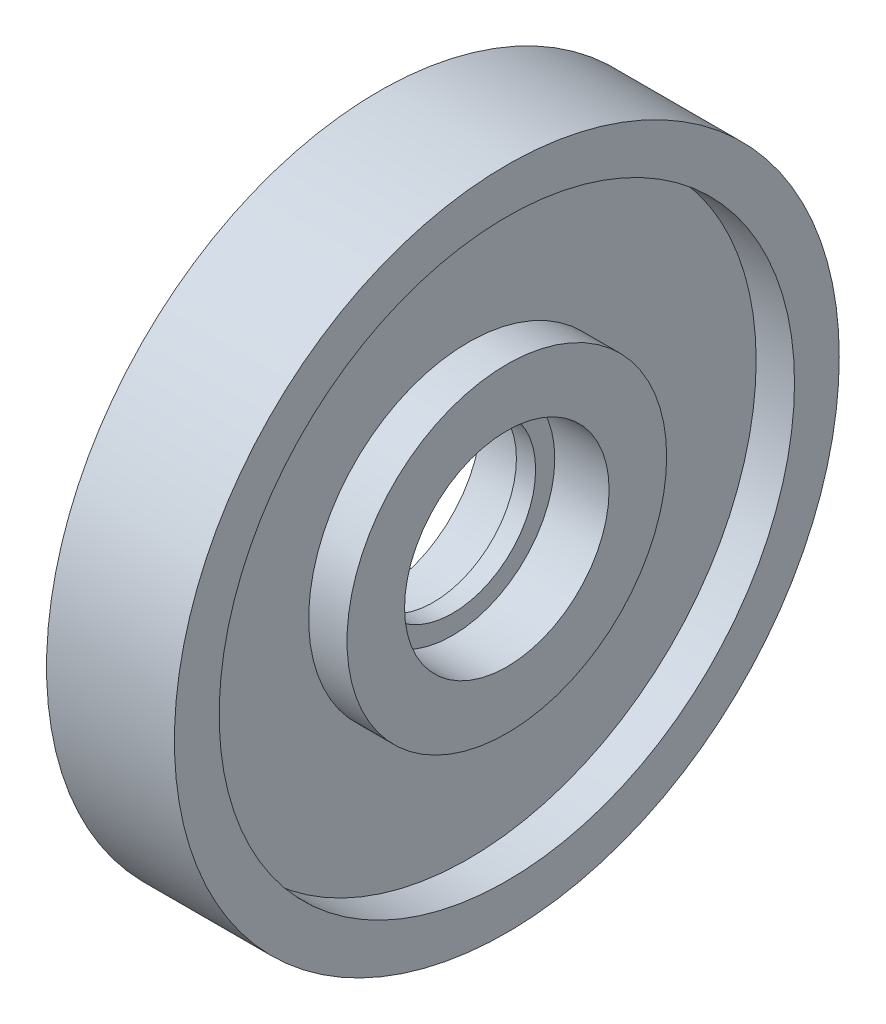
ISO-10303-21;
HEADER;
FILE_DESCRIPTION(('STEP AP214'),'2;1');
FILE_NAME('part.step','',(''),(''),'','','');
FILE_SCHEMA(('AUTOMOTIVE_DESIGN { 1 0 10303 214 1 1 1 1 }'));
ENDSEC;
DATA;
#1=APPLICATION_CONTEXT('core data for automotive mechanical design processes');
#2=APPLICATION_PROTOCOL_DEFINITION('international standard','automotive_design',2000,#1);
#3=PRODUCT_CONTEXT('',#1,'mechanical');
#4=PRODUCT('Part','Part','',(#3));
#5=PRODUCT_RELATED_PRODUCT_CATEGORY('part','',(#4));
#6=PRODUCT_DEFINITION_FORMATION('','',#4);
#7=PRODUCT_DEFINITION_CONTEXT('part definition',#1,'design');
#8=PRODUCT_DEFINITION('design','',#6,#7);
#9=PRODUCT_DEFINITION_SHAPE('','',#8);
#10=(LENGTH_UNIT() NAMED_UNIT(*) SI_UNIT(.MILLI.,.METRE.));
#11=(NAMED_UNIT(*) PLANE_ANGLE_UNIT() SI_UNIT($,.RADIAN.));
#12=(NAMED_UNIT(*) SI_UNIT($,.STERADIAN.) SOLID_ANGLE_UNIT());
#13=UNCERTAINTY_MEASURE_WITH_UNIT(LENGTH_MEASURE(1.E-05),#10,'distance_accuracy_value','');
#14=(GEOMETRIC_REPRESENTATION_CONTEXT(3) GLOBAL_UNCERTAINTY_ASSIGNED_CONTEXT((#13)) GLOBAL_UNIT_ASSIGNED_CONTEXT((#10,
#11,#12)) REPRESENTATION_CONTEXT('',''));
#15=CARTESIAN_POINT('',(0.,0.,0.));
#16=DIRECTION('',(0.,0.,1.));
#17=DIRECTION('',(1.,0.,0.));
#18=AXIS2_PLACEMENT_3D('',#15,#16,#17);
#19=CARTESIAN_POINT('',(0.,0.,0.));
#20=DIRECTION('',(1.,0.,0.));
#21=DIRECTION('',(0.,0.,-1.));
#22=AXIS2_PLACEMENT_3D('',#19,#20,#21);
#23=PLANE('',#22);
#24=CARTESIAN_POINT('',(0.,0.,0.));
#25=DIRECTION('',(1.,0.,0.));
#26=DIRECTION('',(0.,0.,-1.));
#27=AXIS2_PLACEMENT_3D('',#24,#25,#26);
#28=CIRCLE('',#27,8.);
#29=CARTESIAN_POINT('',(0.,0.,-8.));
#30=VERTEX_POINT('',#29);
#31=EDGE_CURVE('E61',#30,#30,#28,.T.);
#32=ORIENTED_EDGE('',*,*,#31,.T.);
#33=EDGE_LOOP('',(#32));
#34=FACE_BOUND('',#33,.T.);
#35=CARTESIAN_POINT('',(0.,0.,0.));
#36=DIRECTION('',(1.,0.,0.));
#37=DIRECTION('',(0.,0.,-1.));
#38=AXIS2_PLACEMENT_3D('',#35,#36,#37);
#39=CIRCLE('',#38,12.5);
#40=CARTESIAN_POINT('',(0.,0.,-12.5));
#41=VERTEX_POINT('',#40);
#42=EDGE_CURVE('E94',#41,#41,#39,.T.);
#43=ORIENTED_EDGE('',*,*,#42,.F.);
#44=EDGE_LOOP('',(#43));
#45=FACE_BOUND('',#44,.T.);
#46=ADVANCED_FACE('F43',(#34,#45),#23,.F.);
#47=CARTESIAN_POINT('',(10.,0.,0.));
#48=DIRECTION('',(1.,0.,0.));
#49=DIRECTION('',(0.,0.,-1.));
#50=AXIS2_PLACEMENT_3D('',#47,#48,#49);
#51=PLANE('',#50);
#52=CARTESIAN_POINT('',(10.,0.,0.));
#53=DIRECTION('',(1.,0.,0.));
#54=DIRECTION('',(0.,0.,-1.));
#55=AXIS2_PLACEMENT_3D('',#52,#53,#54);
#56=CIRCLE('',#55,8.);
#57=CARTESIAN_POINT('',(10.,0.,-8.));
#58=VERTEX_POINT('',#57);
#59=EDGE_CURVE('E59',#58,#58,#56,.T.);
#60=ORIENTED_EDGE('',*,*,#59,.F.);
#61=EDGE_LOOP('',(#60));
#62=FACE_BOUND('',#61,.T.);
#63=CARTESIAN_POINT('',(10.,0.,0.));
#64=DIRECTION('',(1.,0.,0.));
#65=DIRECTION('',(0.,0.,-1.));
#66=AXIS2_PLACEMENT_3D('',#63,#64,#65);
#67=CIRCLE('',#66,12.5);
#68=CARTESIAN_POINT('',(10.,0.,-12.5));
#69=VERTEX_POINT('',#68);
#70=EDGE_CURVE('E82',#69,#69,#67,.T.);
#71=ORIENTED_EDGE('',*,*,#70,.T.);
#72=EDGE_LOOP('',(#71));
#73=FACE_BOUND('',#72,.T.);
#74=ADVANCED_FACE('F110',(#62,#73),#51,.T.);
#75=CARTESIAN_POINT('',(10.,0.,0.));
#76=DIRECTION('',(-1.,0.,0.));
#77=DIRECTION('',(0.,0.,1.));
#78=AXIS2_PLACEMENT_3D('',#75,#76,#77);
#79=CYLINDRICAL_SURFACE('',#78,8.);
#80=ORIENTED_EDGE('',*,*,#31,.F.);
#81=EDGE_LOOP('',(#80));
#82=FACE_BOUND('',#81,.T.);
#83=CARTESIAN_POINT('',(4.25,0.,0.));
#84=DIRECTION('',(1.,0.,0.));
#85=DIRECTION('',(0.,0.,-1.));
#86=AXIS2_PLACEMENT_3D('',#83,#84,#85);
#87=CIRCLE('',#86,8.);
#88=CARTESIAN_POINT('',(4.25,0.,-8.));
#89=VERTEX_POINT('',#88);
#90=EDGE_CURVE('E64',#89,#89,#87,.T.);
#91=ORIENTED_EDGE('',*,*,#90,.T.);
#92=EDGE_LOOP('',(#91));
#93=FACE_BOUND('',#92,.T.);
#94=ADVANCED_FACE('F118',(#82,#93),#79,.F.);
#95=CARTESIAN_POINT('',(10.,0.,0.));
#96=DIRECTION('',(1.,0.,0.));
#97=DIRECTION('',(0.,0.,-1.));
#98=AXIS2_PLACEMENT_3D('',#95,#96,#97);
#99=CIRCLE('',#98,22.5);
#100=CARTESIAN_POINT('',(10.,0.,-22.5));
#101=VERTEX_POINT('',#100);
#102=EDGE_CURVE('E76',#101,#101,#99,.T.);
#103=ORIENTED_EDGE('',*,*,#102,.F.);
#104=EDGE_LOOP('',(#103));
#105=FACE_BOUND('',#104,.T.);
#106=CARTESIAN_POINT('',(10.,0.,0.));
#107=DIRECTION('',(1.,0.,0.));
#108=DIRECTION('',(0.,0.,-1.));
#109=AXIS2_PLACEMENT_3D('',#106,#107,#108);
#110=CIRCLE('',#109,26.);
#111=CARTESIAN_POINT('',(10.,0.,-26.));
#112=VERTEX_POINT('',#111);
#113=EDGE_CURVE('E50',#112,#112,#110,.T.);
#114=ORIENTED_EDGE('',*,*,#113,.T.);
#115=EDGE_LOOP('',(#114));
#116=FACE_BOUND('',#115,.T.);
#117=ADVANCED_FACE('F121',(#105,#116),#51,.T.);
#118=CARTESIAN_POINT('',(0.,0.,0.));
#119=DIRECTION('',(1.,0.,0.));
#120=DIRECTION('',(0.,0.,-1.));
#121=AXIS2_PLACEMENT_3D('',#118,#119,#120);
#122=CIRCLE('',#121,22.5);
#123=CARTESIAN_POINT('',(0.,0.,-22.5));
#124=VERTEX_POINT('',#123);
#125=EDGE_CURVE('E88',#124,#124,#122,.T.);
#126=ORIENTED_EDGE('',*,*,#125,.T.);
#127=EDGE_LOOP('',(#126));
#128=FACE_BOUND('',#127,.T.);
#129=CARTESIAN_POINT('',(0.,0.,0.));
#130=DIRECTION('',(1.,0.,0.));
#131=DIRECTION('',(0.,0.,-1.));
#132=AXIS2_PLACEMENT_3D('',#129,#130,#131);
#133=CIRCLE('',#132,26.);
#134=CARTESIAN_POINT('',(0.,0.,-26.));
#135=VERTEX_POINT('',#134);
#136=EDGE_CURVE('E54',#135,#135,#133,.T.);
#137=ORIENTED_EDGE('',*,*,#136,.F.);
#138=EDGE_LOOP('',(#137));
#139=FACE_BOUND('',#138,.T.);
#140=ADVANCED_FACE('F112',(#128,#139),#23,.F.);
#141=CARTESIAN_POINT('',(10.,0.,0.));
#142=DIRECTION('',(-1.,0.,0.));
#143=DIRECTION('',(0.,0.,1.));
#144=AXIS2_PLACEMENT_3D('',#141,#142,#143);
#145=CYLINDRICAL_SURFACE('',#144,26.);
#146=ORIENTED_EDGE('',*,*,#113,.F.);
#147=EDGE_LOOP('',(#146));
#148=FACE_BOUND('',#147,.T.);
#149=ORIENTED_EDGE('',*,*,#136,.T.);
#150=EDGE_LOOP('',(#149));
#151=FACE_BOUND('',#150,.T.);
#152=ADVANCED_FACE('F45',(#148,#151),#145,.T.);
#153=CARTESIAN_POINT('',(5.75,0.,0.));
#154=DIRECTION('',(1.,0.,0.));
#155=DIRECTION('',(0.,0.,-1.));
#156=AXIS2_PLACEMENT_3D('',#153,#154,#155);
#157=CIRCLE('',#156,8.);
#158=CARTESIAN_POINT('',(5.75,0.,-8.));
#159=VERTEX_POINT('',#158);
#160=EDGE_CURVE('E10',#159,#159,#157,.T.);
#161=ORIENTED_EDGE('',*,*,#160,.F.);
#162=EDGE_LOOP('',(#161));
#163=FACE_BOUND('',#162,.T.);
#164=ORIENTED_EDGE('',*,*,#59,.T.);
#165=EDGE_LOOP('',(#164));
#166=FACE_BOUND('',#165,.T.);
#167=ADVANCED_FACE('F127',(#163,#166),#79,.F.);
#168=CARTESIAN_POINT('',(5.75,0.,0.));
#169=DIRECTION('',(1.,0.,0.));
#170=DIRECTION('',(0.,0.,-1.));
#171=AXIS2_PLACEMENT_3D('',#168,#169,#170);
#172=PLANE('',#171);
#173=ORIENTED_EDGE('',*,*,#160,.T.);
#174=EDGE_LOOP('',(#173));
#175=FACE_BOUND('',#174,.T.);
#176=CARTESIAN_POINT('',(5.75,0.,0.));
#177=DIRECTION('',(1.,0.,0.));
#178=DIRECTION('',(0.,0.,-1.));
#179=AXIS2_PLACEMENT_3D('',#176,#177,#178);
#180=CIRCLE('',#179,6.5);
#181=CARTESIAN_POINT('',(5.75,0.,-6.5));
#182=VERTEX_POINT('',#181);
#183=EDGE_CURVE('E69',#182,#182,#180,.T.);
#184=ORIENTED_EDGE('',*,*,#183,.F.);
#185=EDGE_LOOP('',(#184));
#186=FACE_BOUND('',#185,.T.);
#187=ADVANCED_FACE('F160',(#175,#186),#172,.T.);
#188=CARTESIAN_POINT('',(4.25,0.,0.));
#189=DIRECTION('',(1.,0.,0.));
#190=DIRECTION('',(0.,0.,-1.));
#191=AXIS2_PLACEMENT_3D('',#188,#189,#190);
#192=PLANE('',#191);
#193=ORIENTED_EDGE('',*,*,#90,.F.);
#194=EDGE_LOOP('',(#193));
#195=FACE_BOUND('',#194,.T.);
#196=CARTESIAN_POINT('',(4.25,0.,0.));
#197=DIRECTION('',(1.,0.,0.));
#198=DIRECTION('',(0.,0.,-1.));
#199=AXIS2_PLACEMENT_3D('',#196,#197,#198);
#200=CIRCLE('',#199,6.5);
#201=CARTESIAN_POINT('',(4.25,0.,-6.5));
#202=VERTEX_POINT('',#201);
#203=EDGE_CURVE('E70',#202,#202,#200,.T.);
#204=ORIENTED_EDGE('',*,*,#203,.T.);
#205=EDGE_LOOP('',(#204));
#206=FACE_BOUND('',#205,.T.);
#207=ADVANCED_FACE('F158',(#195,#206),#192,.F.);
#208=CARTESIAN_POINT('',(5.75,0.,0.));
#209=DIRECTION('',(-1.,0.,0.));
#210=DIRECTION('',(0.,0.,1.));
#211=AXIS2_PLACEMENT_3D('',#208,#209,#210);
#212=CYLINDRICAL_SURFACE('',#211,6.5);
#213=ORIENTED_EDGE('',*,*,#183,.T.);
#214=EDGE_LOOP('',(#213));
#215=FACE_BOUND('',#214,.T.);
#216=ORIENTED_EDGE('',*,*,#203,.F.);
#217=EDGE_LOOP('',(#216));
#218=FACE_BOUND('',#217,.T.);
#219=ADVANCED_FACE('F154',(#215,#218),#212,.F.);
#220=CARTESIAN_POINT('',(7.,0.,0.));
#221=DIRECTION('',(1.,0.,0.));
#222=DIRECTION('',(0.,0.,-1.));
#223=AXIS2_PLACEMENT_3D('',#220,#221,#222);
#224=CYLINDRICAL_SURFACE('',#223,22.5);
#225=CARTESIAN_POINT('',(7.,0.,0.));
#226=DIRECTION('',(1.,0.,0.));
#227=DIRECTION('',(0.,0.,-1.));
#228=AXIS2_PLACEMENT_3D('',#225,#226,#227);
#229=CIRCLE('',#228,22.5);
#230=CARTESIAN_POINT('',(7.,0.,-22.5));
#231=VERTEX_POINT('',#230);
#232=EDGE_CURVE('E73',#231,#231,#229,.T.);
#233=ORIENTED_EDGE('',*,*,#232,.F.);
#234=EDGE_LOOP('',(#233));
#235=FACE_BOUND('',#234,.T.);
#236=ORIENTED_EDGE('',*,*,#102,.T.);
#237=EDGE_LOOP('',(#236));
#238=FACE_BOUND('',#237,.T.);
#239=ADVANCED_FACE('F150',(#235,#238),#224,.F.);
#240=CARTESIAN_POINT('',(7.,0.,0.));
#241=DIRECTION('',(1.,0.,0.));
#242=DIRECTION('',(0.,0.,-1.));
#243=AXIS2_PLACEMENT_3D('',#240,#241,#242);
#244=PLANE('',#243);
#245=CARTESIAN_POINT('',(7.,0.,0.));
#246=DIRECTION('',(1.,0.,0.));
#247=DIRECTION('',(0.,0.,-1.));
#248=AXIS2_PLACEMENT_3D('',#245,#246,#247);
#249=CIRCLE('',#248,12.5);
#250=CARTESIAN_POINT('',(7.,0.,-12.5));
#251=VERTEX_POINT('',#250);
#252=EDGE_CURVE('E79',#251,#251,#249,.T.);
#253=ORIENTED_EDGE('',*,*,#252,.F.);
#254=EDGE_LOOP('',(#253));
#255=FACE_BOUND('',#254,.T.);
#256=ORIENTED_EDGE('',*,*,#232,.T.);
#257=EDGE_LOOP('',(#256));
#258=FACE_BOUND('',#257,.T.);
#259=ADVANCED_FACE('F146',(#255,#258),#244,.T.);
#260=CARTESIAN_POINT('',(7.,0.,0.));
#261=DIRECTION('',(1.,0.,0.));
#262=DIRECTION('',(0.,0.,-1.));
#263=AXIS2_PLACEMENT_3D('',#260,#261,#262);
#264=CYLINDRICAL_SURFACE('',#263,12.5);
#265=ORIENTED_EDGE('',*,*,#252,.T.);
#266=EDGE_LOOP('',(#265));
#267=FACE_BOUND('',#266,.T.);
#268=ORIENTED_EDGE('',*,*,#70,.F.);
#269=EDGE_LOOP('',(#268));
#270=FACE_BOUND('',#269,.T.);
#271=ADVANCED_FACE('F141',(#267,#270),#264,.T.);
#272=CARTESIAN_POINT('',(3.,0.,0.));
#273=DIRECTION('',(-1.,0.,0.));
#274=DIRECTION('',(0.,0.,-1.));
#275=AXIS2_PLACEMENT_3D('',#272,#273,#274);
#276=PLANE('',#275);
#277=CARTESIAN_POINT('',(3.,0.,0.));
#278=DIRECTION('',(1.,0.,0.));
#279=DIRECTION('',(0.,0.,-1.));
#280=AXIS2_PLACEMENT_3D('',#277,#278,#279);
#281=CIRCLE('',#280,22.5);
#282=CARTESIAN_POINT('',(3.,0.,-22.5));
#283=VERTEX_POINT('',#282);
#284=EDGE_CURVE('E85',#283,#283,#281,.T.);
#285=ORIENTED_EDGE('',*,*,#284,.F.);
#286=EDGE_LOOP('',(#285));
#287=FACE_BOUND('',#286,.T.);
#288=CARTESIAN_POINT('',(3.,0.,0.));
#289=DIRECTION('',(1.,0.,0.));
#290=DIRECTION('',(0.,0.,-1.));
#291=AXIS2_PLACEMENT_3D('',#288,#289,#290);
#292=CIRCLE('',#291,12.5);
#293=CARTESIAN_POINT('',(3.,0.,-12.5));
#294=VERTEX_POINT('',#293);
#295=EDGE_CURVE('E91',#294,#294,#292,.T.);
#296=ORIENTED_EDGE('',*,*,#295,.T.);
#297=EDGE_LOOP('',(#296));
#298=FACE_BOUND('',#297,.T.);
#299=ADVANCED_FACE('F100',(#287,#298),#276,.T.);
#300=CARTESIAN_POINT('',(3.,0.,0.));
#301=DIRECTION('',(-1.,0.,0.));
#302=DIRECTION('',(0.,0.,1.));
#303=AXIS2_PLACEMENT_3D('',#300,#301,#302);
#304=CYLINDRICAL_SURFACE('',#303,22.5);
#305=ORIENTED_EDGE('',*,*,#284,.T.);
#306=EDGE_LOOP('',(#305));
#307=FACE_BOUND('',#306,.T.);
#308=ORIENTED_EDGE('',*,*,#125,.F.);
#309=EDGE_LOOP('',(#308));
#310=FACE_BOUND('',#309,.T.);
#311=ADVANCED_FACE('F105',(#307,#310),#304,.F.);
#312=CARTESIAN_POINT('',(3.,0.,0.));
#313=DIRECTION('',(-1.,0.,0.));
#314=DIRECTION('',(0.,0.,1.));
#315=AXIS2_PLACEMENT_3D('',#312,#313,#314);
#316=CYLINDRICAL_SURFACE('',#315,12.5);
#317=ORIENTED_EDGE('',*,*,#295,.F.);
#318=EDGE_LOOP('',(#317));
#319=FACE_BOUND('',#318,.T.);
#320=ORIENTED_EDGE('',*,*,#42,.T.);
#321=EDGE_LOOP('',(#320));
#322=FACE_BOUND('',#321,.T.);
#323=ADVANCED_FACE('F102',(#319,#322),#316,.T.);
#324=CLOSED_SHELL('',(#46,#74,#94,#117,#140,#152,#167,#187,#207,#219,#239,#259,#271,#299,#311,#323));
#325=MANIFOLD_SOLID_BREP('B2',#324);
#326=ADVANCED_BREP_SHAPE_REPRESENTATION('',(#18,#325),#14);
#327=SHAPE_DEFINITION_REPRESENTATION(#9,#326);
ENDSEC;
END-ISO-10303-21;
